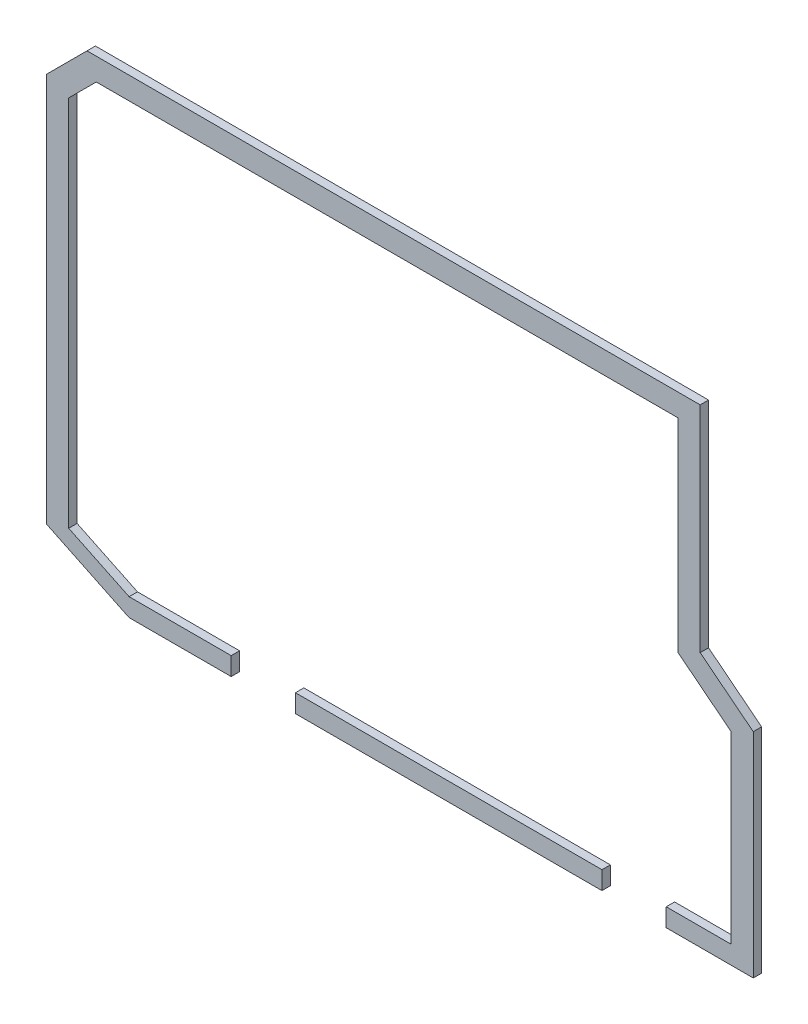
ISO-10303-21;
HEADER;
FILE_DESCRIPTION(('STEP AP214'),'2;1');
FILE_NAME('part.step','',(''),(''),'','','');
FILE_SCHEMA(('AUTOMOTIVE_DESIGN { 1 0 10303 214 1 1 1 1 }'));
ENDSEC;
DATA;
#1=APPLICATION_CONTEXT('core data for automotive mechanical design processes');
#2=APPLICATION_PROTOCOL_DEFINITION('international standard','automotive_design',2000,#1);
#3=PRODUCT_CONTEXT('',#1,'mechanical');
#4=PRODUCT('Part','Part','',(#3));
#5=PRODUCT_RELATED_PRODUCT_CATEGORY('part','',(#4));
#6=PRODUCT_DEFINITION_FORMATION('','',#4);
#7=PRODUCT_DEFINITION_CONTEXT('part definition',#1,'design');
#8=PRODUCT_DEFINITION('design','',#6,#7);
#9=PRODUCT_DEFINITION_SHAPE('','',#8);
#10=(LENGTH_UNIT() NAMED_UNIT(*) SI_UNIT(.MILLI.,.METRE.));
#11=(NAMED_UNIT(*) PLANE_ANGLE_UNIT() SI_UNIT($,.RADIAN.));
#12=(NAMED_UNIT(*) SI_UNIT($,.STERADIAN.) SOLID_ANGLE_UNIT());
#13=UNCERTAINTY_MEASURE_WITH_UNIT(LENGTH_MEASURE(1.E-05),#10,'distance_accuracy_value','');
#14=(GEOMETRIC_REPRESENTATION_CONTEXT(3) GLOBAL_UNCERTAINTY_ASSIGNED_CONTEXT((#13)) GLOBAL_UNIT_ASSIGNED_CONTEXT((#10,
#11,#12)) REPRESENTATION_CONTEXT('',''));
#15=CARTESIAN_POINT('',(0.,0.,0.));
#16=DIRECTION('',(0.,0.,1.));
#17=DIRECTION('',(1.,0.,0.));
#18=AXIS2_PLACEMENT_3D('',#15,#16,#17);
#19=CARTESIAN_POINT('',(140.800000000002,23.0000000000004,6.));
#20=DIRECTION('',(0.,1.,0.));
#21=DIRECTION('',(-1.,0.,0.));
#22=AXIS2_PLACEMENT_3D('',#19,#20,#21);
#23=PLANE('',#22);
#24=DIRECTION('',(1.,0.,0.));
#25=VECTOR('',#24,1.);
#26=CARTESIAN_POINT('',(140.800000000002,23.0000000000004,0.));
#27=LINE('',#26,#25);
#28=CARTESIAN_POINT('',(140.800000000002,23.0000000000004,0.));
#29=VERTEX_POINT('',#28);
#30=CARTESIAN_POINT('',(360.200000000002,23.0000000000004,0.));
#31=VERTEX_POINT('',#30);
#32=EDGE_CURVE('E106',#29,#31,#27,.T.);
#33=ORIENTED_EDGE('',*,*,#32,.T.);
#34=DIRECTION('',(0.,0.,-1.));
#35=VECTOR('',#34,1.);
#36=CARTESIAN_POINT('',(360.200000000002,23.0000000000004,6.));
#37=LINE('',#36,#35);
#38=CARTESIAN_POINT('',(360.200000000002,23.0000000000004,6.));
#39=VERTEX_POINT('',#38);
#40=EDGE_CURVE('E12',#39,#31,#37,.T.);
#41=ORIENTED_EDGE('',*,*,#40,.F.);
#42=DIRECTION('',(1.,0.,0.));
#43=VECTOR('',#42,1.);
#44=CARTESIAN_POINT('',(140.800000000002,23.0000000000004,6.));
#45=LINE('',#44,#43);
#46=CARTESIAN_POINT('',(140.800000000002,23.0000000000004,6.));
#47=VERTEX_POINT('',#46);
#48=EDGE_CURVE('E94',#47,#39,#45,.T.);
#49=ORIENTED_EDGE('',*,*,#48,.F.);
#50=DIRECTION('',(0.,0.,-1.));
#51=VECTOR('',#50,1.);
#52=CARTESIAN_POINT('',(140.800000000002,23.0000000000004,6.));
#53=LINE('',#52,#51);
#54=EDGE_CURVE('E102',#47,#29,#53,.T.);
#55=ORIENTED_EDGE('',*,*,#54,.T.);
#56=EDGE_LOOP('',(#33,#41,#49,#55));
#57=FACE_BOUND('',#56,.T.);
#58=ADVANCED_FACE('F43',(#57),#23,.F.);
#59=CARTESIAN_POINT('',(360.200000000002,36.0000000000003,6.));
#60=DIRECTION('',(-1.,0.,0.));
#61=DIRECTION('',(0.,-1.,0.));
#62=AXIS2_PLACEMENT_3D('',#59,#60,#61);
#63=PLANE('',#62);
#64=DIRECTION('',(0.,1.,0.));
#65=VECTOR('',#64,1.);
#66=CARTESIAN_POINT('',(360.200000000002,36.0000000000003,0.));
#67=LINE('',#66,#65);
#68=CARTESIAN_POINT('',(360.200000000002,36.0000000000003,0.));
#69=VERTEX_POINT('',#68);
#70=EDGE_CURVE('E98',#31,#69,#67,.T.);
#71=ORIENTED_EDGE('',*,*,#70,.T.);
#72=DIRECTION('',(0.,0.,-1.));
#73=VECTOR('',#72,1.);
#74=CARTESIAN_POINT('',(360.200000000002,36.0000000000003,6.));
#75=LINE('',#74,#73);
#76=CARTESIAN_POINT('',(360.200000000002,36.0000000000003,6.));
#77=VERTEX_POINT('',#76);
#78=EDGE_CURVE('E51',#77,#69,#75,.T.);
#79=ORIENTED_EDGE('',*,*,#78,.F.);
#80=DIRECTION('',(0.,1.,0.));
#81=VECTOR('',#80,1.);
#82=CARTESIAN_POINT('',(360.200000000002,36.0000000000003,6.));
#83=LINE('',#82,#81);
#84=EDGE_CURVE('E89',#39,#77,#83,.T.);
#85=ORIENTED_EDGE('',*,*,#84,.F.);
#86=ORIENTED_EDGE('',*,*,#40,.T.);
#87=EDGE_LOOP('',(#71,#79,#85,#86));
#88=FACE_BOUND('',#87,.T.);
#89=ADVANCED_FACE('F97',(#88),#63,.F.);
#90=CARTESIAN_POINT('',(140.800000000002,36.0000000000004,6.));
#91=DIRECTION('',(0.,-1.,0.));
#92=DIRECTION('',(1.,0.,0.));
#93=AXIS2_PLACEMENT_3D('',#90,#91,#92);
#94=PLANE('',#93);
#95=DIRECTION('',(-1.,0.,0.));
#96=VECTOR('',#95,1.);
#97=CARTESIAN_POINT('',(140.800000000002,36.0000000000004,0.));
#98=LINE('',#97,#96);
#99=CARTESIAN_POINT('',(140.800000000002,36.0000000000004,0.));
#100=VERTEX_POINT('',#99);
#101=EDGE_CURVE('E76',#69,#100,#98,.T.);
#102=ORIENTED_EDGE('',*,*,#101,.T.);
#103=DIRECTION('',(0.,0.,-1.));
#104=VECTOR('',#103,1.);
#105=CARTESIAN_POINT('',(140.800000000002,36.0000000000004,6.));
#106=LINE('',#105,#104);
#107=CARTESIAN_POINT('',(140.800000000002,36.0000000000004,6.));
#108=VERTEX_POINT('',#107);
#109=EDGE_CURVE('E99',#108,#100,#106,.T.);
#110=ORIENTED_EDGE('',*,*,#109,.F.);
#111=DIRECTION('',(-1.,0.,0.));
#112=VECTOR('',#111,1.);
#113=CARTESIAN_POINT('',(140.800000000002,36.0000000000004,6.));
#114=LINE('',#113,#112);
#115=EDGE_CURVE('E92',#77,#108,#114,.T.);
#116=ORIENTED_EDGE('',*,*,#115,.F.);
#117=ORIENTED_EDGE('',*,*,#78,.T.);
#118=EDGE_LOOP('',(#102,#110,#116,#117));
#119=FACE_BOUND('',#118,.T.);
#120=ADVANCED_FACE('F100',(#119),#94,.F.);
#121=CARTESIAN_POINT('',(140.800000000002,23.0000000000004,6.));
#122=DIRECTION('',(1.,0.,0.));
#123=DIRECTION('',(0.,0.,-1.));
#124=AXIS2_PLACEMENT_3D('',#121,#122,#123);
#125=PLANE('',#124);
#126=DIRECTION('',(0.,-1.,0.));
#127=VECTOR('',#126,1.);
#128=CARTESIAN_POINT('',(140.800000000002,23.0000000000004,0.));
#129=LINE('',#128,#127);
#130=EDGE_CURVE('E82',#100,#29,#129,.T.);
#131=ORIENTED_EDGE('',*,*,#130,.T.);
#132=ORIENTED_EDGE('',*,*,#54,.F.);
#133=DIRECTION('',(0.,-1.,0.));
#134=VECTOR('',#133,1.);
#135=CARTESIAN_POINT('',(140.800000000002,23.0000000000004,6.));
#136=LINE('',#135,#134);
#137=EDGE_CURVE('E59',#108,#47,#136,.T.);
#138=ORIENTED_EDGE('',*,*,#137,.F.);
#139=ORIENTED_EDGE('',*,*,#109,.T.);
#140=EDGE_LOOP('',(#131,#132,#138,#139));
#141=FACE_BOUND('',#140,.T.);
#142=ADVANCED_FACE('F113',(#141),#125,.F.);
#143=CARTESIAN_POINT('',(0.,0.,6.));
#144=DIRECTION('',(0.,0.,-1.));
#145=DIRECTION('',(-1.,0.,0.));
#146=AXIS2_PLACEMENT_3D('',#143,#144,#145);
#147=PLANE('',#146);
#148=ORIENTED_EDGE('',*,*,#48,.T.);
#149=ORIENTED_EDGE('',*,*,#84,.T.);
#150=ORIENTED_EDGE('',*,*,#115,.T.);
#151=ORIENTED_EDGE('',*,*,#137,.T.);
#152=EDGE_LOOP('',(#148,#149,#150,#151));
#153=FACE_BOUND('',#152,.T.);
#154=ADVANCED_FACE('F90',(#153),#147,.F.);
#155=CARTESIAN_POINT('',(0.,0.,0.));
#156=DIRECTION('',(0.,0.,-1.));
#157=DIRECTION('',(-1.,0.,0.));
#158=AXIS2_PLACEMENT_3D('',#155,#156,#157);
#159=PLANE('',#158);
#160=ORIENTED_EDGE('',*,*,#32,.F.);
#161=ORIENTED_EDGE('',*,*,#130,.F.);
#162=ORIENTED_EDGE('',*,*,#101,.F.);
#163=ORIENTED_EDGE('',*,*,#70,.F.);
#164=EDGE_LOOP('',(#160,#161,#162,#163));
#165=FACE_BOUND('',#164,.T.);
#166=ADVANCED_FACE('F116',(#165),#159,.T.);
#167=CLOSED_SHELL('',(#58,#89,#120,#142,#154,#166));
#168=MANIFOLD_SOLID_BREP('B2',#167);
#169=CARTESIAN_POINT('',(468.500000000001,23.0000000000002,6.));
#170=DIRECTION('',(-1.,0.,0.));
#171=DIRECTION('',(0.,0.,1.));
#172=AXIS2_PLACEMENT_3D('',#169,#170,#171);
#173=PLANE('',#172);
#174=DIRECTION('',(0.,1.,0.));
#175=VECTOR('',#174,1.);
#176=CARTESIAN_POINT('',(468.500000000001,23.0000000000002,0.));
#177=LINE('',#176,#175);
#178=CARTESIAN_POINT('',(468.500000000001,23.0000000000002,0.));
#179=VERTEX_POINT('',#178);
#180=CARTESIAN_POINT('',(468.500000000001,175.692213585093,0.));
#181=VERTEX_POINT('',#180);
#182=EDGE_CURVE('E339',#179,#181,#177,.T.);
#183=ORIENTED_EDGE('',*,*,#182,.T.);
#184=DIRECTION('',(0.,0.,-1.));
#185=VECTOR('',#184,1.);
#186=CARTESIAN_POINT('',(468.500000000001,175.692213585093,6.));
#187=LINE('',#186,#185);
#188=CARTESIAN_POINT('',(468.500000000001,175.692213585093,6.));
#189=VERTEX_POINT('',#188);
#190=EDGE_CURVE('E175',#189,#181,#187,.T.);
#191=ORIENTED_EDGE('',*,*,#190,.F.);
#192=DIRECTION('',(0.,1.,0.));
#193=VECTOR('',#192,1.);
#194=CARTESIAN_POINT('',(468.500000000001,23.0000000000002,6.));
#195=LINE('',#194,#193);
#196=CARTESIAN_POINT('',(468.500000000001,23.0000000000002,6.));
#197=VERTEX_POINT('',#196);
#198=EDGE_CURVE('E263',#197,#189,#195,.T.);
#199=ORIENTED_EDGE('',*,*,#198,.F.);
#200=DIRECTION('',(0.,0.,-1.));
#201=VECTOR('',#200,1.);
#202=CARTESIAN_POINT('',(468.500000000001,23.0000000000002,6.));
#203=LINE('',#202,#201);
#204=EDGE_CURVE('E41',#197,#179,#203,.T.);
#205=ORIENTED_EDGE('',*,*,#204,.T.);
#206=EDGE_LOOP('',(#183,#191,#199,#205));
#207=FACE_BOUND('',#206,.T.);
#208=ADVANCED_FACE('F167',(#207),#173,.F.);
#209=CARTESIAN_POINT('',(468.500000000001,175.692213585093,6.));
#210=DIRECTION('',(-0.619644288579022,-0.784882765533426,0.));
#211=DIRECTION('',(0.784882765533426,-0.619644288579022,0.));
#212=AXIS2_PLACEMENT_3D('',#209,#210,#211);
#213=PLANE('',#212);
#214=DIRECTION('',(-0.784882765533426,0.619644288579022,0.));
#215=VECTOR('',#214,1.);
#216=CARTESIAN_POINT('',(468.500000000001,175.692213585093,0.));
#217=LINE('',#216,#215);
#218=CARTESIAN_POINT('',(430.500000000001,205.692213585093,0.));
#219=VERTEX_POINT('',#218);
#220=EDGE_CURVE('E341',#181,#219,#217,.T.);
#221=ORIENTED_EDGE('',*,*,#220,.T.);
#222=DIRECTION('',(0.,0.,-1.));
#223=VECTOR('',#222,1.);
#224=CARTESIAN_POINT('',(430.500000000001,205.692213585093,6.));
#225=LINE('',#224,#223);
#226=CARTESIAN_POINT('',(430.500000000001,205.692213585093,6.));
#227=VERTEX_POINT('',#226);
#228=EDGE_CURVE('E419',#227,#219,#225,.T.);
#229=ORIENTED_EDGE('',*,*,#228,.F.);
#230=DIRECTION('',(-0.784882765533426,0.619644288579022,0.));
#231=VECTOR('',#230,1.);
#232=CARTESIAN_POINT('',(468.500000000001,175.692213585093,6.));
#233=LINE('',#232,#231);
#234=EDGE_CURVE('E427',#189,#227,#233,.T.);
#235=ORIENTED_EDGE('',*,*,#234,.F.);
#236=ORIENTED_EDGE('',*,*,#190,.T.);
#237=EDGE_LOOP('',(#221,#229,#235,#236));
#238=FACE_BOUND('',#237,.T.);
#239=ADVANCED_FACE('F425',(#238),#213,.F.);
#240=CARTESIAN_POINT('',(430.500000000001,205.692213585093,6.));
#241=DIRECTION('',(-1.,0.,0.));
#242=DIRECTION('',(0.,0.,1.));
#243=AXIS2_PLACEMENT_3D('',#240,#241,#242);
#244=PLANE('',#243);
#245=DIRECTION('',(0.,1.,0.));
#246=VECTOR('',#245,1.);
#247=CARTESIAN_POINT('',(430.500000000001,205.692213585093,0.));
#248=LINE('',#247,#246);
#249=CARTESIAN_POINT('',(430.500000000001,359.300000000001,0.));
#250=VERTEX_POINT('',#249);
#251=EDGE_CURVE('E343',#219,#250,#248,.T.);
#252=ORIENTED_EDGE('',*,*,#251,.T.);
#253=DIRECTION('',(0.,0.,-1.));
#254=VECTOR('',#253,1.);
#255=CARTESIAN_POINT('',(430.500000000001,359.300000000001,6.));
#256=LINE('',#255,#254);
#257=CARTESIAN_POINT('',(430.500000000001,359.300000000001,6.));
#258=VERTEX_POINT('',#257);
#259=EDGE_CURVE('E416',#258,#250,#256,.T.);
#260=ORIENTED_EDGE('',*,*,#259,.F.);
#261=DIRECTION('',(0.,1.,0.));
#262=VECTOR('',#261,1.);
#263=CARTESIAN_POINT('',(430.500000000001,205.692213585093,6.));
#264=LINE('',#263,#262);
#265=EDGE_CURVE('E446',#227,#258,#264,.T.);
#266=ORIENTED_EDGE('',*,*,#265,.F.);
#267=ORIENTED_EDGE('',*,*,#228,.T.);
#268=EDGE_LOOP('',(#252,#260,#266,#267));
#269=FACE_BOUND('',#268,.T.);
#270=ADVANCED_FACE('F437',(#269),#244,.F.);
#271=CARTESIAN_POINT('',(430.500000000001,359.300000000001,6.));
#272=DIRECTION('',(0.,-1.,0.));
#273=DIRECTION('',(0.,0.,-1.));
#274=AXIS2_PLACEMENT_3D('',#271,#272,#273);
#275=PLANE('',#274);
#276=DIRECTION('',(-1.,0.,0.));
#277=VECTOR('',#276,1.);
#278=CARTESIAN_POINT('',(430.500000000001,359.300000000001,0.));
#279=LINE('',#278,#277);
#280=CARTESIAN_POINT('',(-8.39949493660852,359.300000000001,0.));
#281=VERTEX_POINT('',#280);
#282=EDGE_CURVE('E345',#250,#281,#279,.T.);
#283=ORIENTED_EDGE('',*,*,#282,.T.);
#284=DIRECTION('',(0.,0.,-1.));
#285=VECTOR('',#284,1.);
#286=CARTESIAN_POINT('',(-8.39949493660852,359.300000000001,6.));
#287=LINE('',#286,#285);
#288=CARTESIAN_POINT('',(-8.39949493660852,359.300000000001,6.));
#289=VERTEX_POINT('',#288);
#290=EDGE_CURVE('E413',#289,#281,#287,.T.);
#291=ORIENTED_EDGE('',*,*,#290,.F.);
#292=DIRECTION('',(-1.,0.,0.));
#293=VECTOR('',#292,1.);
#294=CARTESIAN_POINT('',(430.500000000001,359.300000000001,6.));
#295=LINE('',#294,#293);
#296=EDGE_CURVE('E443',#258,#289,#295,.T.);
#297=ORIENTED_EDGE('',*,*,#296,.F.);
#298=ORIENTED_EDGE('',*,*,#259,.T.);
#299=EDGE_LOOP('',(#283,#291,#297,#298));
#300=FACE_BOUND('',#299,.T.);
#301=ADVANCED_FACE('F441',(#300),#275,.F.);
#302=CARTESIAN_POINT('',(-8.39949493660852,359.300000000001,6.));
#303=DIRECTION('',(0.707106781186548,-0.707106781186548,0.));
#304=DIRECTION('',(0.707106781186548,0.707106781186548,0.));
#305=AXIS2_PLACEMENT_3D('',#302,#303,#304);
#306=PLANE('',#305);
#307=DIRECTION('',(-0.707106781186547,-0.707106781186547,0.));
#308=VECTOR('',#307,1.);
#309=CARTESIAN_POINT('',(-8.39949493660852,359.300000000001,0.));
#310=LINE('',#309,#308);
#311=CARTESIAN_POINT('',(-37.4999999999976,330.199494936612,0.));
#312=VERTEX_POINT('',#311);
#313=EDGE_CURVE('E347',#281,#312,#310,.T.);
#314=ORIENTED_EDGE('',*,*,#313,.T.);
#315=DIRECTION('',(0.,0.,-1.));
#316=VECTOR('',#315,1.);
#317=CARTESIAN_POINT('',(-37.4999999999976,330.199494936612,6.));
#318=LINE('',#317,#316);
#319=CARTESIAN_POINT('',(-37.4999999999976,330.199494936612,6.));
#320=VERTEX_POINT('',#319);
#321=EDGE_CURVE('E410',#320,#312,#318,.T.);
#322=ORIENTED_EDGE('',*,*,#321,.F.);
#323=DIRECTION('',(-0.707106781186547,-0.707106781186547,0.));
#324=VECTOR('',#323,1.);
#325=CARTESIAN_POINT('',(-8.39949493660852,359.300000000001,6.));
#326=LINE('',#325,#324);
#327=EDGE_CURVE('E445',#289,#320,#326,.T.);
#328=ORIENTED_EDGE('',*,*,#327,.F.);
#329=ORIENTED_EDGE('',*,*,#290,.T.);
#330=EDGE_LOOP('',(#314,#322,#328,#329));
#331=FACE_BOUND('',#330,.T.);
#332=ADVANCED_FACE('F504',(#331),#306,.F.);
#333=CARTESIAN_POINT('',(-37.4999999999976,330.199494936612,6.));
#334=DIRECTION('',(1.,0.,0.));
#335=DIRECTION('',(0.,1.,0.));
#336=AXIS2_PLACEMENT_3D('',#333,#334,#335);
#337=PLANE('',#336);
#338=DIRECTION('',(0.,-1.,0.));
#339=VECTOR('',#338,1.);
#340=CARTESIAN_POINT('',(-37.4999999999976,330.199494936612,0.));
#341=LINE('',#340,#339);
#342=CARTESIAN_POINT('',(-37.4999999999976,51.4749516720581,0.));
#343=VERTEX_POINT('',#342);
#344=EDGE_CURVE('E349',#312,#343,#341,.T.);
#345=ORIENTED_EDGE('',*,*,#344,.T.);
#346=DIRECTION('',(0.,0.,-1.));
#347=VECTOR('',#346,1.);
#348=CARTESIAN_POINT('',(-37.4999999999976,51.4749516720581,6.));
#349=LINE('',#348,#347);
#350=CARTESIAN_POINT('',(-37.4999999999976,51.4749516720581,6.));
#351=VERTEX_POINT('',#350);
#352=EDGE_CURVE('E407',#351,#343,#349,.T.);
#353=ORIENTED_EDGE('',*,*,#352,.F.);
#354=DIRECTION('',(0.,-1.,0.));
#355=VECTOR('',#354,1.);
#356=CARTESIAN_POINT('',(-37.4999999999976,330.199494936612,6.));
#357=LINE('',#356,#355);
#358=EDGE_CURVE('E448',#320,#351,#357,.T.);
#359=ORIENTED_EDGE('',*,*,#358,.F.);
#360=ORIENTED_EDGE('',*,*,#321,.T.);
#361=EDGE_LOOP('',(#345,#353,#359,#360));
#362=FACE_BOUND('',#361,.T.);
#363=ADVANCED_FACE('F507',(#362),#337,.F.);
#364=CARTESIAN_POINT('',(-29.4999999999976,47.6287978259043,6.));
#365=DIRECTION('',(0.433294434867878,0.901252424525186,0.));
#366=DIRECTION('',(-0.901252424525186,0.433294434867878,0.));
#367=AXIS2_PLACEMENT_3D('',#364,#365,#366);
#368=PLANE('',#367);
#369=DIRECTION('',(0.901252424525186,-0.433294434867878,0.));
#370=VECTOR('',#369,1.);
#371=CARTESIAN_POINT('',(-29.4999999999976,47.6287978259043,0.));
#372=LINE('',#371,#370);
#373=CARTESIAN_POINT('',(21.7278994778829,23.0000000000002,0.));
#374=VERTEX_POINT('',#373);
#375=EDGE_CURVE('E352',#343,#374,#372,.T.);
#376=ORIENTED_EDGE('',*,*,#375,.T.);
#377=DIRECTION('',(0.,0.,-1.));
#378=VECTOR('',#377,1.);
#379=CARTESIAN_POINT('',(21.7278994778829,23.0000000000002,6.));
#380=LINE('',#379,#378);
#381=CARTESIAN_POINT('',(21.7278994778829,23.0000000000002,6.));
#382=VERTEX_POINT('',#381);
#383=EDGE_CURVE('E404',#382,#374,#380,.T.);
#384=ORIENTED_EDGE('',*,*,#383,.F.);
#385=DIRECTION('',(0.901252424525186,-0.433294434867878,0.));
#386=VECTOR('',#385,1.);
#387=CARTESIAN_POINT('',(-29.4999999999976,47.6287978259043,6.));
#388=LINE('',#387,#386);
#389=EDGE_CURVE('E454',#351,#382,#388,.T.);
#390=ORIENTED_EDGE('',*,*,#389,.F.);
#391=ORIENTED_EDGE('',*,*,#352,.T.);
#392=EDGE_LOOP('',(#376,#384,#390,#391));
#393=FACE_BOUND('',#392,.T.);
#394=ADVANCED_FACE('F511',(#393),#368,.F.);
#395=CARTESIAN_POINT('',(21.7278994778829,23.0000000000002,6.));
#396=DIRECTION('',(0.,1.,0.));
#397=DIRECTION('',(-1.,0.,0.));
#398=AXIS2_PLACEMENT_3D('',#395,#396,#397);
#399=PLANE('',#398);
#400=DIRECTION('',(1.,0.,0.));
#401=VECTOR('',#400,1.);
#402=CARTESIAN_POINT('',(21.7278994778829,23.0000000000002,0.));
#403=LINE('',#402,#401);
#404=CARTESIAN_POINT('',(94.8000000000025,23.0000000000003,0.));
#405=VERTEX_POINT('',#404);
#406=EDGE_CURVE('E354',#374,#405,#403,.T.);
#407=ORIENTED_EDGE('',*,*,#406,.T.);
#408=DIRECTION('',(0.,0.,-1.));
#409=VECTOR('',#408,1.);
#410=CARTESIAN_POINT('',(94.8000000000025,23.0000000000003,6.));
#411=LINE('',#410,#409);
#412=CARTESIAN_POINT('',(94.8000000000025,23.0000000000003,6.));
#413=VERTEX_POINT('',#412);
#414=EDGE_CURVE('E401',#413,#405,#411,.T.);
#415=ORIENTED_EDGE('',*,*,#414,.F.);
#416=DIRECTION('',(1.,0.,0.));
#417=VECTOR('',#416,1.);
#418=CARTESIAN_POINT('',(21.7278994778829,23.0000000000002,6.));
#419=LINE('',#418,#417);
#420=EDGE_CURVE('E456',#382,#413,#419,.T.);
#421=ORIENTED_EDGE('',*,*,#420,.F.);
#422=ORIENTED_EDGE('',*,*,#383,.T.);
#423=EDGE_LOOP('',(#407,#415,#421,#422));
#424=FACE_BOUND('',#423,.T.);
#425=ADVANCED_FACE('F515',(#424),#399,.F.);
#426=CARTESIAN_POINT('',(94.8000000000025,36.0000000000003,6.));
#427=DIRECTION('',(-1.,0.,0.));
#428=DIRECTION('',(0.,-1.,0.));
#429=AXIS2_PLACEMENT_3D('',#426,#427,#428);
#430=PLANE('',#429);
#431=DIRECTION('',(0.,1.,0.));
#432=VECTOR('',#431,1.);
#433=CARTESIAN_POINT('',(94.8000000000025,36.0000000000003,0.));
#434=LINE('',#433,#432);
#435=CARTESIAN_POINT('',(94.8000000000025,36.0000000000003,0.));
#436=VERTEX_POINT('',#435);
#437=EDGE_CURVE('E356',#405,#436,#434,.T.);
#438=ORIENTED_EDGE('',*,*,#437,.T.);
#439=DIRECTION('',(0.,0.,-1.));
#440=VECTOR('',#439,1.);
#441=CARTESIAN_POINT('',(94.8000000000025,36.0000000000003,6.));
#442=LINE('',#441,#440);
#443=CARTESIAN_POINT('',(94.8000000000025,36.0000000000003,6.));
#444=VERTEX_POINT('',#443);
#445=EDGE_CURVE('E398',#444,#436,#442,.T.);
#446=ORIENTED_EDGE('',*,*,#445,.F.);
#447=DIRECTION('',(0.,1.,0.));
#448=VECTOR('',#447,1.);
#449=CARTESIAN_POINT('',(94.8000000000025,36.0000000000003,6.));
#450=LINE('',#449,#448);
#451=EDGE_CURVE('E458',#413,#444,#450,.T.);
#452=ORIENTED_EDGE('',*,*,#451,.F.);
#453=ORIENTED_EDGE('',*,*,#414,.T.);
#454=EDGE_LOOP('',(#438,#446,#452,#453));
#455=FACE_BOUND('',#454,.T.);
#456=ADVANCED_FACE('F519',(#455),#430,.F.);
#457=CARTESIAN_POINT('',(94.8000000000025,36.0000000000003,6.));
#458=DIRECTION('',(0.,-1.,0.));
#459=DIRECTION('',(0.,0.,-1.));
#460=AXIS2_PLACEMENT_3D('',#457,#458,#459);
#461=PLANE('',#460);
#462=DIRECTION('',(-1.,0.,0.));
#463=VECTOR('',#462,1.);
#464=CARTESIAN_POINT('',(94.8000000000025,36.0000000000003,0.));
#465=LINE('',#464,#463);
#466=CARTESIAN_POINT('',(21.7278994778829,36.0000000000003,0.));
#467=VERTEX_POINT('',#466);
#468=EDGE_CURVE('E358',#436,#467,#465,.T.);
#469=ORIENTED_EDGE('',*,*,#468,.T.);
#470=DIRECTION('',(0.,0.,-1.));
#471=VECTOR('',#470,1.);
#472=CARTESIAN_POINT('',(21.7278994778829,36.0000000000003,6.));
#473=LINE('',#472,#471);
#474=CARTESIAN_POINT('',(21.7278994778829,36.0000000000003,6.));
#475=VERTEX_POINT('',#474);
#476=EDGE_CURVE('E395',#475,#467,#473,.T.);
#477=ORIENTED_EDGE('',*,*,#476,.F.);
#478=DIRECTION('',(-1.,0.,0.));
#479=VECTOR('',#478,1.);
#480=CARTESIAN_POINT('',(94.8000000000025,36.0000000000003,6.));
#481=LINE('',#480,#479);
#482=EDGE_CURVE('E460',#444,#475,#481,.T.);
#483=ORIENTED_EDGE('',*,*,#482,.F.);
#484=ORIENTED_EDGE('',*,*,#445,.T.);
#485=EDGE_LOOP('',(#469,#477,#483,#484));
#486=FACE_BOUND('',#485,.T.);
#487=ADVANCED_FACE('F523',(#486),#461,.F.);
#488=CARTESIAN_POINT('',(21.7278994778829,36.0000000000003,6.));
#489=DIRECTION('',(-0.433294434867878,-0.901252424525186,0.));
#490=DIRECTION('',(0.901252424525186,-0.433294434867878,0.));
#491=AXIS2_PLACEMENT_3D('',#488,#489,#490);
#492=PLANE('',#491);
#493=DIRECTION('',(-0.901252424525186,0.433294434867878,0.));
#494=VECTOR('',#493,1.);
#495=CARTESIAN_POINT('',(21.7278994778829,36.0000000000003,0.));
#496=LINE('',#495,#494);
#497=CARTESIAN_POINT('',(-21.4999999999976,56.7826439797505,0.));
#498=VERTEX_POINT('',#497);
#499=EDGE_CURVE('E360',#467,#498,#496,.T.);
#500=ORIENTED_EDGE('',*,*,#499,.T.);
#501=DIRECTION('',(0.,0.,-1.));
#502=VECTOR('',#501,1.);
#503=CARTESIAN_POINT('',(-21.4999999999976,56.7826439797505,6.));
#504=LINE('',#503,#502);
#505=CARTESIAN_POINT('',(-21.4999999999976,56.7826439797505,6.));
#506=VERTEX_POINT('',#505);
#507=EDGE_CURVE('E392',#506,#498,#504,.T.);
#508=ORIENTED_EDGE('',*,*,#507,.F.);
#509=DIRECTION('',(-0.901252424525186,0.433294434867878,0.));
#510=VECTOR('',#509,1.);
#511=CARTESIAN_POINT('',(21.7278994778829,36.0000000000003,6.));
#512=LINE('',#511,#510);
#513=EDGE_CURVE('E462',#475,#506,#512,.T.);
#514=ORIENTED_EDGE('',*,*,#513,.F.);
#515=ORIENTED_EDGE('',*,*,#476,.T.);
#516=EDGE_LOOP('',(#500,#508,#514,#515));
#517=FACE_BOUND('',#516,.T.);
#518=ADVANCED_FACE('F527',(#517),#492,.F.);
#519=CARTESIAN_POINT('',(-21.4999999999976,323.572077938642,6.));
#520=DIRECTION('',(-1.,0.,0.));
#521=DIRECTION('',(0.,-1.,0.));
#522=AXIS2_PLACEMENT_3D('',#519,#520,#521);
#523=PLANE('',#522);
#524=DIRECTION('',(0.,1.,0.));
#525=VECTOR('',#524,1.);
#526=CARTESIAN_POINT('',(-21.4999999999976,323.572077938642,0.));
#527=LINE('',#526,#525);
#528=CARTESIAN_POINT('',(-21.4999999999976,323.572077938642,0.));
#529=VERTEX_POINT('',#528);
#530=EDGE_CURVE('E362',#498,#529,#527,.T.);
#531=ORIENTED_EDGE('',*,*,#530,.T.);
#532=DIRECTION('',(0.,0.,-1.));
#533=VECTOR('',#532,1.);
#534=CARTESIAN_POINT('',(-21.4999999999976,323.572077938642,6.));
#535=LINE('',#534,#533);
#536=CARTESIAN_POINT('',(-21.4999999999976,323.572077938642,6.));
#537=VERTEX_POINT('',#536);
#538=EDGE_CURVE('E389',#537,#529,#535,.T.);
#539=ORIENTED_EDGE('',*,*,#538,.F.);
#540=DIRECTION('',(0.,1.,0.));
#541=VECTOR('',#540,1.);
#542=CARTESIAN_POINT('',(-21.4999999999976,323.572077938642,6.));
#543=LINE('',#542,#541);
#544=EDGE_CURVE('E464',#506,#537,#543,.T.);
#545=ORIENTED_EDGE('',*,*,#544,.F.);
#546=ORIENTED_EDGE('',*,*,#507,.T.);
#547=EDGE_LOOP('',(#531,#539,#545,#546));
#548=FACE_BOUND('',#547,.T.);
#549=ADVANCED_FACE('F531',(#548),#523,.F.);
#550=CARTESIAN_POINT('',(-1.77207793863905,343.300000000001,6.));
#551=DIRECTION('',(-0.707106781186547,0.707106781186548,0.));
#552=DIRECTION('',(-0.707106781186548,-0.707106781186547,0.));
#553=AXIS2_PLACEMENT_3D('',#550,#551,#552);
#554=PLANE('',#553);
#555=DIRECTION('',(0.707106781186548,0.707106781186547,0.));
#556=VECTOR('',#555,1.);
#557=CARTESIAN_POINT('',(-1.77207793863905,343.300000000001,0.));
#558=LINE('',#557,#556);
#559=CARTESIAN_POINT('',(-1.77207793863905,343.300000000001,0.));
#560=VERTEX_POINT('',#559);
#561=EDGE_CURVE('E364',#529,#560,#558,.T.);
#562=ORIENTED_EDGE('',*,*,#561,.T.);
#563=DIRECTION('',(0.,0.,-1.));
#564=VECTOR('',#563,1.);
#565=CARTESIAN_POINT('',(-1.77207793863905,343.300000000001,6.));
#566=LINE('',#565,#564);
#567=CARTESIAN_POINT('',(-1.77207793863905,343.300000000001,6.));
#568=VERTEX_POINT('',#567);
#569=EDGE_CURVE('E386',#568,#560,#566,.T.);
#570=ORIENTED_EDGE('',*,*,#569,.F.);
#571=DIRECTION('',(0.707106781186548,0.707106781186547,0.));
#572=VECTOR('',#571,1.);
#573=CARTESIAN_POINT('',(-1.77207793863905,343.300000000001,6.));
#574=LINE('',#573,#572);
#575=EDGE_CURVE('E466',#537,#568,#574,.T.);
#576=ORIENTED_EDGE('',*,*,#575,.F.);
#577=ORIENTED_EDGE('',*,*,#538,.T.);
#578=EDGE_LOOP('',(#562,#570,#576,#577));
#579=FACE_BOUND('',#578,.T.);
#580=ADVANCED_FACE('F535',(#579),#554,.F.);
#581=CARTESIAN_POINT('',(414.500000000001,343.300000000001,6.));
#582=DIRECTION('',(0.,1.,0.));
#583=DIRECTION('',(0.,0.,1.));
#584=AXIS2_PLACEMENT_3D('',#581,#582,#583);
#585=PLANE('',#584);
#586=DIRECTION('',(1.,0.,0.));
#587=VECTOR('',#586,1.);
#588=CARTESIAN_POINT('',(414.500000000001,343.300000000001,0.));
#589=LINE('',#588,#587);
#590=CARTESIAN_POINT('',(414.500000000001,343.300000000001,0.));
#591=VERTEX_POINT('',#590);
#592=EDGE_CURVE('E366',#560,#591,#589,.T.);
#593=ORIENTED_EDGE('',*,*,#592,.T.);
#594=DIRECTION('',(0.,0.,-1.));
#595=VECTOR('',#594,1.);
#596=CARTESIAN_POINT('',(414.500000000001,343.300000000001,6.));
#597=LINE('',#596,#595);
#598=CARTESIAN_POINT('',(414.500000000001,343.300000000001,6.));
#599=VERTEX_POINT('',#598);
#600=EDGE_CURVE('E383',#599,#591,#597,.T.);
#601=ORIENTED_EDGE('',*,*,#600,.F.);
#602=DIRECTION('',(1.,0.,0.));
#603=VECTOR('',#602,1.);
#604=CARTESIAN_POINT('',(414.500000000001,343.300000000001,6.));
#605=LINE('',#604,#603);
#606=EDGE_CURVE('E468',#568,#599,#605,.T.);
#607=ORIENTED_EDGE('',*,*,#606,.F.);
#608=ORIENTED_EDGE('',*,*,#569,.T.);
#609=EDGE_LOOP('',(#593,#601,#607,#608));
#610=FACE_BOUND('',#609,.T.);
#611=ADVANCED_FACE('F539',(#610),#585,.F.);
#612=CARTESIAN_POINT('',(414.500000000001,197.938582533454,6.));
#613=DIRECTION('',(1.,0.,0.));
#614=DIRECTION('',(0.,0.,-1.));
#615=AXIS2_PLACEMENT_3D('',#612,#613,#614);
#616=PLANE('',#615);
#617=DIRECTION('',(0.,-1.,0.));
#618=VECTOR('',#617,1.);
#619=CARTESIAN_POINT('',(414.500000000001,197.938582533454,0.));
#620=LINE('',#619,#618);
#621=CARTESIAN_POINT('',(414.500000000001,197.938582533454,0.));
#622=VERTEX_POINT('',#621);
#623=EDGE_CURVE('E368',#591,#622,#620,.T.);
#624=ORIENTED_EDGE('',*,*,#623,.T.);
#625=DIRECTION('',(0.,0.,-1.));
#626=VECTOR('',#625,1.);
#627=CARTESIAN_POINT('',(414.500000000001,197.938582533454,6.));
#628=LINE('',#627,#626);
#629=CARTESIAN_POINT('',(414.500000000001,197.938582533454,6.));
#630=VERTEX_POINT('',#629);
#631=EDGE_CURVE('E380',#630,#622,#628,.T.);
#632=ORIENTED_EDGE('',*,*,#631,.F.);
#633=DIRECTION('',(0.,-1.,0.));
#634=VECTOR('',#633,1.);
#635=CARTESIAN_POINT('',(414.500000000001,197.938582533454,6.));
#636=LINE('',#635,#634);
#637=EDGE_CURVE('E470',#599,#630,#636,.T.);
#638=ORIENTED_EDGE('',*,*,#637,.F.);
#639=ORIENTED_EDGE('',*,*,#600,.T.);
#640=EDGE_LOOP('',(#624,#632,#638,#639));
#641=FACE_BOUND('',#640,.T.);
#642=ADVANCED_FACE('F476',(#641),#616,.F.);
#643=CARTESIAN_POINT('',(452.500000000001,167.938582533454,6.));
#644=DIRECTION('',(0.619644288579021,0.784882765533426,0.));
#645=DIRECTION('',(-0.784882765533426,0.619644288579021,0.));
#646=AXIS2_PLACEMENT_3D('',#643,#644,#645);
#647=PLANE('',#646);
#648=DIRECTION('',(0.784882765533426,-0.619644288579021,0.));
#649=VECTOR('',#648,1.);
#650=CARTESIAN_POINT('',(452.500000000001,167.938582533454,0.));
#651=LINE('',#650,#649);
#652=CARTESIAN_POINT('',(452.500000000001,167.938582533454,0.));
#653=VERTEX_POINT('',#652);
#654=EDGE_CURVE('E370',#622,#653,#651,.T.);
#655=ORIENTED_EDGE('',*,*,#654,.T.);
#656=DIRECTION('',(0.,0.,-1.));
#657=VECTOR('',#656,1.);
#658=CARTESIAN_POINT('',(452.500000000001,167.938582533454,6.));
#659=LINE('',#658,#657);
#660=CARTESIAN_POINT('',(452.500000000001,167.938582533454,6.));
#661=VERTEX_POINT('',#660);
#662=EDGE_CURVE('E328',#661,#653,#659,.T.);
#663=ORIENTED_EDGE('',*,*,#662,.F.);
#664=DIRECTION('',(0.784882765533426,-0.619644288579021,0.));
#665=VECTOR('',#664,1.);
#666=CARTESIAN_POINT('',(452.500000000001,167.938582533454,6.));
#667=LINE('',#666,#665);
#668=EDGE_CURVE('E319',#630,#661,#667,.T.);
#669=ORIENTED_EDGE('',*,*,#668,.F.);
#670=ORIENTED_EDGE('',*,*,#631,.T.);
#671=EDGE_LOOP('',(#655,#663,#669,#670));
#672=FACE_BOUND('',#671,.T.);
#673=ADVANCED_FACE('F480',(#672),#647,.F.);
#674=CARTESIAN_POINT('',(452.500000000001,36.0000000000004,6.));
#675=DIRECTION('',(1.,0.,0.));
#676=DIRECTION('',(0.,0.,-1.));
#677=AXIS2_PLACEMENT_3D('',#674,#675,#676);
#678=PLANE('',#677);
#679=DIRECTION('',(0.,-1.,0.));
#680=VECTOR('',#679,1.);
#681=CARTESIAN_POINT('',(452.500000000001,36.0000000000004,0.));
#682=LINE('',#681,#680);
#683=CARTESIAN_POINT('',(452.500000000001,36.0000000000004,0.));
#684=VERTEX_POINT('',#683);
#685=EDGE_CURVE('E327',#653,#684,#682,.T.);
#686=ORIENTED_EDGE('',*,*,#685,.T.);
#687=DIRECTION('',(0.,0.,-1.));
#688=VECTOR('',#687,1.);
#689=CARTESIAN_POINT('',(452.500000000001,36.0000000000004,6.));
#690=LINE('',#689,#688);
#691=CARTESIAN_POINT('',(452.500000000001,36.0000000000004,6.));
#692=VERTEX_POINT('',#691);
#693=EDGE_CURVE('E324',#692,#684,#690,.T.);
#694=ORIENTED_EDGE('',*,*,#693,.F.);
#695=DIRECTION('',(0.,-1.,0.));
#696=VECTOR('',#695,1.);
#697=CARTESIAN_POINT('',(452.500000000001,36.0000000000004,6.));
#698=LINE('',#697,#696);
#699=EDGE_CURVE('E313',#661,#692,#698,.T.);
#700=ORIENTED_EDGE('',*,*,#699,.F.);
#701=ORIENTED_EDGE('',*,*,#662,.T.);
#702=EDGE_LOOP('',(#686,#694,#700,#701));
#703=FACE_BOUND('',#702,.T.);
#704=ADVANCED_FACE('F325',(#703),#678,.F.);
#705=CARTESIAN_POINT('',(406.200000000002,36.0000000000004,6.));
#706=DIRECTION('',(0.,-1.,0.));
#707=DIRECTION('',(0.,0.,-1.));
#708=AXIS2_PLACEMENT_3D('',#705,#706,#707);
#709=PLANE('',#708);
#710=DIRECTION('',(-1.,0.,0.));
#711=VECTOR('',#710,1.);
#712=CARTESIAN_POINT('',(406.200000000002,36.0000000000004,0.));
#713=LINE('',#712,#711);
#714=CARTESIAN_POINT('',(406.200000000002,36.0000000000004,0.));
#715=VERTEX_POINT('',#714);
#716=EDGE_CURVE('E249',#684,#715,#713,.T.);
#717=ORIENTED_EDGE('',*,*,#716,.T.);
#718=DIRECTION('',(0.,0.,-1.));
#719=VECTOR('',#718,1.);
#720=CARTESIAN_POINT('',(406.200000000002,36.0000000000004,6.));
#721=LINE('',#720,#719);
#722=CARTESIAN_POINT('',(406.200000000002,36.0000000000004,6.));
#723=VERTEX_POINT('',#722);
#724=EDGE_CURVE('E329',#723,#715,#721,.T.);
#725=ORIENTED_EDGE('',*,*,#724,.F.);
#726=DIRECTION('',(-1.,0.,0.));
#727=VECTOR('',#726,1.);
#728=CARTESIAN_POINT('',(406.200000000002,36.0000000000004,6.));
#729=LINE('',#728,#727);
#730=EDGE_CURVE('E317',#692,#723,#729,.T.);
#731=ORIENTED_EDGE('',*,*,#730,.F.);
#732=ORIENTED_EDGE('',*,*,#693,.T.);
#733=EDGE_LOOP('',(#717,#725,#731,#732));
#734=FACE_BOUND('',#733,.T.);
#735=ADVANCED_FACE('F331',(#734),#709,.F.);
#736=CARTESIAN_POINT('',(406.200000000002,23.0000000000004,6.));
#737=DIRECTION('',(1.,0.,0.));
#738=DIRECTION('',(0.,1.,0.));
#739=AXIS2_PLACEMENT_3D('',#736,#737,#738);
#740=PLANE('',#739);
#741=DIRECTION('',(0.,-1.,0.));
#742=VECTOR('',#741,1.);
#743=CARTESIAN_POINT('',(406.200000000002,23.0000000000004,0.));
#744=LINE('',#743,#742);
#745=CARTESIAN_POINT('',(406.200000000002,23.0000000000004,0.));
#746=VERTEX_POINT('',#745);
#747=EDGE_CURVE('E256',#715,#746,#744,.T.);
#748=ORIENTED_EDGE('',*,*,#747,.T.);
#749=DIRECTION('',(0.,0.,-1.));
#750=VECTOR('',#749,1.);
#751=CARTESIAN_POINT('',(406.200000000002,23.0000000000004,6.));
#752=LINE('',#751,#750);
#753=CARTESIAN_POINT('',(406.200000000002,23.0000000000004,6.));
#754=VERTEX_POINT('',#753);
#755=EDGE_CURVE('E335',#754,#746,#752,.T.);
#756=ORIENTED_EDGE('',*,*,#755,.F.);
#757=DIRECTION('',(0.,-1.,0.));
#758=VECTOR('',#757,1.);
#759=CARTESIAN_POINT('',(406.200000000002,23.0000000000004,6.));
#760=LINE('',#759,#758);
#761=EDGE_CURVE('E333',#723,#754,#760,.T.);
#762=ORIENTED_EDGE('',*,*,#761,.F.);
#763=ORIENTED_EDGE('',*,*,#724,.T.);
#764=EDGE_LOOP('',(#748,#756,#762,#763));
#765=FACE_BOUND('',#764,.T.);
#766=ADVANCED_FACE('F482',(#765),#740,.F.);
#767=CARTESIAN_POINT('',(406.200000000002,23.0000000000004,6.));
#768=DIRECTION('',(0.,1.,0.));
#769=DIRECTION('',(-1.,0.,0.));
#770=AXIS2_PLACEMENT_3D('',#767,#768,#769);
#771=PLANE('',#770);
#772=DIRECTION('',(1.,0.,0.));
#773=VECTOR('',#772,1.);
#774=CARTESIAN_POINT('',(406.200000000002,23.0000000000004,0.));
#775=LINE('',#774,#773);
#776=EDGE_CURVE('E375',#746,#179,#775,.T.);
#777=ORIENTED_EDGE('',*,*,#776,.T.);
#778=ORIENTED_EDGE('',*,*,#204,.F.);
#779=DIRECTION('',(1.,0.,0.));
#780=VECTOR('',#779,1.);
#781=CARTESIAN_POINT('',(460.500000000001,23.0000000000002,6.));
#782=LINE('',#781,#780);
#783=EDGE_CURVE('E183',#754,#197,#782,.T.);
#784=ORIENTED_EDGE('',*,*,#783,.F.);
#785=ORIENTED_EDGE('',*,*,#755,.T.);
#786=EDGE_LOOP('',(#777,#778,#784,#785));
#787=FACE_BOUND('',#786,.T.);
#788=ADVANCED_FACE('F481',(#787),#771,.F.);
#789=CARTESIAN_POINT('',(0.,0.,6.));
#790=DIRECTION('',(0.,0.,1.));
#791=DIRECTION('',(1.,0.,0.));
#792=AXIS2_PLACEMENT_3D('',#789,#790,#791);
#793=PLANE('',#792);
#794=ORIENTED_EDGE('',*,*,#783,.T.);
#795=ORIENTED_EDGE('',*,*,#198,.T.);
#796=ORIENTED_EDGE('',*,*,#234,.T.);
#797=ORIENTED_EDGE('',*,*,#265,.T.);
#798=ORIENTED_EDGE('',*,*,#296,.T.);
#799=ORIENTED_EDGE('',*,*,#327,.T.);
#800=ORIENTED_EDGE('',*,*,#358,.T.);
#801=ORIENTED_EDGE('',*,*,#389,.T.);
#802=ORIENTED_EDGE('',*,*,#420,.T.);
#803=ORIENTED_EDGE('',*,*,#451,.T.);
#804=ORIENTED_EDGE('',*,*,#482,.T.);
#805=ORIENTED_EDGE('',*,*,#513,.T.);
#806=ORIENTED_EDGE('',*,*,#544,.T.);
#807=ORIENTED_EDGE('',*,*,#575,.T.);
#808=ORIENTED_EDGE('',*,*,#606,.T.);
#809=ORIENTED_EDGE('',*,*,#637,.T.);
#810=ORIENTED_EDGE('',*,*,#668,.T.);
#811=ORIENTED_EDGE('',*,*,#699,.T.);
#812=ORIENTED_EDGE('',*,*,#730,.T.);
#813=ORIENTED_EDGE('',*,*,#761,.T.);
#814=EDGE_LOOP('',(#794,#795,#796,#797,#798,#799,#800,#801,#802,#803,#804,#805,#806,#807,#808,
#809,#810,#811,#812,#813));
#815=FACE_BOUND('',#814,.T.);
#816=ADVANCED_FACE('F315',(#815),#793,.T.);
#817=CARTESIAN_POINT('',(0.,0.,0.));
#818=DIRECTION('',(0.,0.,1.));
#819=DIRECTION('',(1.,0.,0.));
#820=AXIS2_PLACEMENT_3D('',#817,#818,#819);
#821=PLANE('',#820);
#822=ORIENTED_EDGE('',*,*,#182,.F.);
#823=ORIENTED_EDGE('',*,*,#776,.F.);
#824=ORIENTED_EDGE('',*,*,#747,.F.);
#825=ORIENTED_EDGE('',*,*,#716,.F.);
#826=ORIENTED_EDGE('',*,*,#685,.F.);
#827=ORIENTED_EDGE('',*,*,#654,.F.);
#828=ORIENTED_EDGE('',*,*,#623,.F.);
#829=ORIENTED_EDGE('',*,*,#592,.F.);
#830=ORIENTED_EDGE('',*,*,#561,.F.);
#831=ORIENTED_EDGE('',*,*,#530,.F.);
#832=ORIENTED_EDGE('',*,*,#499,.F.);
#833=ORIENTED_EDGE('',*,*,#468,.F.);
#834=ORIENTED_EDGE('',*,*,#437,.F.);
#835=ORIENTED_EDGE('',*,*,#406,.F.);
#836=ORIENTED_EDGE('',*,*,#375,.F.);
#837=ORIENTED_EDGE('',*,*,#344,.F.);
#838=ORIENTED_EDGE('',*,*,#313,.F.);
#839=ORIENTED_EDGE('',*,*,#282,.F.);
#840=ORIENTED_EDGE('',*,*,#251,.F.);
#841=ORIENTED_EDGE('',*,*,#220,.F.);
#842=EDGE_LOOP('',(#822,#823,#824,#825,#826,#827,#828,#829,#830,#831,#832,#833,#834,#835,#836,
#837,#838,#839,#840,#841));
#843=FACE_BOUND('',#842,.T.);
#844=ADVANCED_FACE('F431',(#843),#821,.F.);
#845=CLOSED_SHELL('',(#208,#239,#270,#301,#332,#363,#394,#425,#456,#487,#518,#549,#580,#611,
#642,#673,#704,#735,#766,#788,#816,#844));
#846=MANIFOLD_SOLID_BREP('B6',#845);
#847=ADVANCED_BREP_SHAPE_REPRESENTATION('',(#18,#168,#846),#14);
#848=SHAPE_DEFINITION_REPRESENTATION(#9,#847);
ENDSEC;
END-ISO-10303-21;
